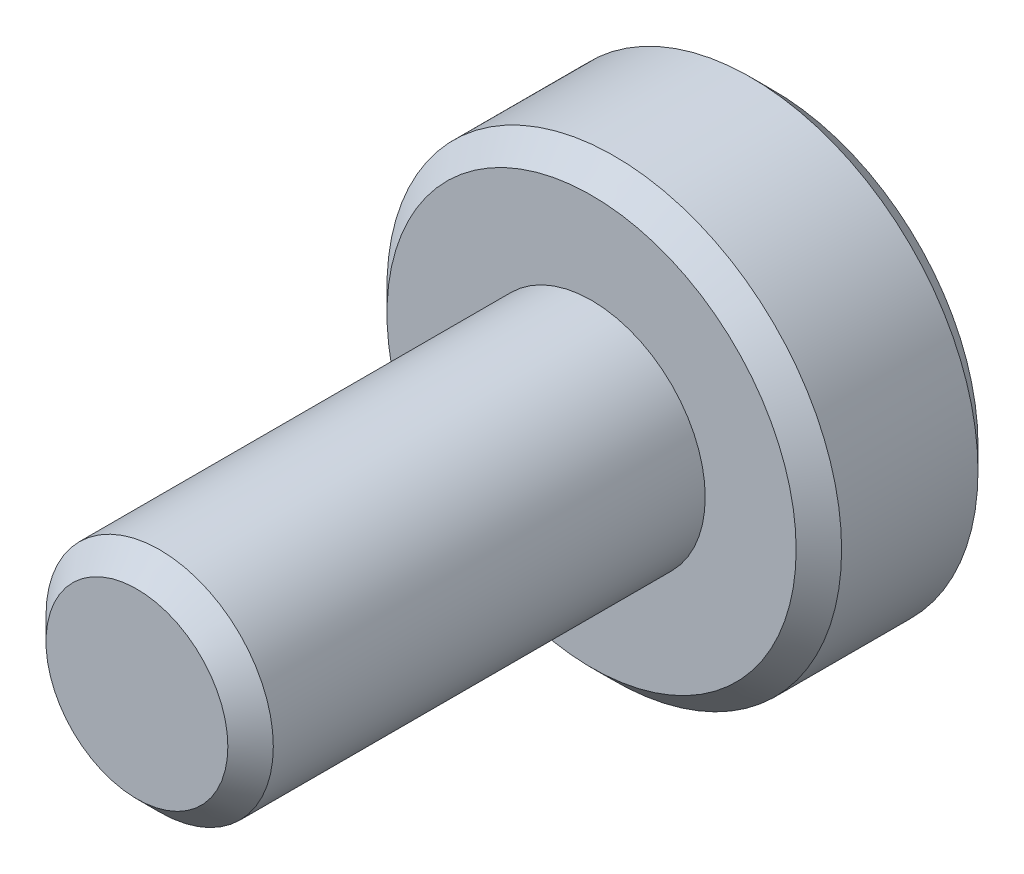
ISO-10303-21;
HEADER;
FILE_DESCRIPTION(('STEP AP214'),'2;1');
FILE_NAME('part.step','',(''),(''),'','','');
FILE_SCHEMA(('AUTOMOTIVE_DESIGN { 1 0 10303 214 1 1 1 1 }'));
ENDSEC;
DATA;
#1=APPLICATION_CONTEXT('core data for automotive mechanical design processes');
#2=APPLICATION_PROTOCOL_DEFINITION('international standard','automotive_design',2000,#1);
#3=PRODUCT_CONTEXT('',#1,'mechanical');
#4=PRODUCT('Part','Part','',(#3));
#5=PRODUCT_RELATED_PRODUCT_CATEGORY('part','',(#4));
#6=PRODUCT_DEFINITION_FORMATION('','',#4);
#7=PRODUCT_DEFINITION_CONTEXT('part definition',#1,'design');
#8=PRODUCT_DEFINITION('design','',#6,#7);
#9=PRODUCT_DEFINITION_SHAPE('','',#8);
#10=(LENGTH_UNIT() NAMED_UNIT(*) SI_UNIT(.MILLI.,.METRE.));
#11=(NAMED_UNIT(*) PLANE_ANGLE_UNIT() SI_UNIT($,.RADIAN.));
#12=(NAMED_UNIT(*) SI_UNIT($,.STERADIAN.) SOLID_ANGLE_UNIT());
#13=UNCERTAINTY_MEASURE_WITH_UNIT(LENGTH_MEASURE(1.E-05),#10,'distance_accuracy_value','');
#14=(GEOMETRIC_REPRESENTATION_CONTEXT(3) GLOBAL_UNCERTAINTY_ASSIGNED_CONTEXT((#13)) GLOBAL_UNIT_ASSIGNED_CONTEXT((#10,
#11,#12)) REPRESENTATION_CONTEXT('',''));
#15=CARTESIAN_POINT('',(0.,0.,0.));
#16=DIRECTION('',(0.,0.,1.));
#17=DIRECTION('',(1.,0.,0.));
#18=AXIS2_PLACEMENT_3D('',#15,#16,#17);
#19=CARTESIAN_POINT('',(0.,0.,8.));
#20=DIRECTION('',(0.,0.,-1.));
#21=DIRECTION('',(-1.,0.,0.));
#22=AXIS2_PLACEMENT_3D('',#19,#20,#21);
#23=CYLINDRICAL_SURFACE('',#22,10.);
#24=CARTESIAN_POINT('',(0.,0.,0.999999999999996));
#25=DIRECTION('',(0.,0.,1.));
#26=DIRECTION('',(1.,0.,0.));
#27=AXIS2_PLACEMENT_3D('',#24,#25,#26);
#28=CIRCLE('',#27,10.);
#29=CARTESIAN_POINT('',(10.,0.,0.999999999999996));
#30=VERTEX_POINT('',#29);
#31=EDGE_CURVE('E64',#30,#30,#28,.T.);
#32=ORIENTED_EDGE('',*,*,#31,.T.);
#33=EDGE_LOOP('',(#32));
#34=FACE_BOUND('',#33,.T.);
#35=CARTESIAN_POINT('',(0.,0.,7.));
#36=DIRECTION('',(0.,0.,1.));
#37=DIRECTION('',(1.,0.,0.));
#38=AXIS2_PLACEMENT_3D('',#35,#36,#37);
#39=CIRCLE('',#38,10.);
#40=CARTESIAN_POINT('',(10.,0.,7.));
#41=VERTEX_POINT('',#40);
#42=EDGE_CURVE('E68',#41,#41,#39,.F.);
#43=ORIENTED_EDGE('',*,*,#42,.T.);
#44=EDGE_LOOP('',(#43));
#45=FACE_BOUND('',#44,.T.);
#46=ADVANCED_FACE('F39',(#34,#45),#23,.T.);
#47=CARTESIAN_POINT('',(0.,0.,8.));
#48=DIRECTION('',(0.,0.,1.));
#49=DIRECTION('',(1.,0.,0.));
#50=AXIS2_PLACEMENT_3D('',#47,#48,#49);
#51=PLANE('',#50);
#52=CARTESIAN_POINT('',(0.,0.,8.));
#53=DIRECTION('',(0.,0.,1.));
#54=DIRECTION('',(1.,0.,0.));
#55=AXIS2_PLACEMENT_3D('',#52,#53,#54);
#56=CIRCLE('',#55,9.);
#57=CARTESIAN_POINT('',(9.,0.,8.));
#58=VERTEX_POINT('',#57);
#59=EDGE_CURVE('E53',#58,#58,#56,.T.);
#60=ORIENTED_EDGE('',*,*,#59,.T.);
#61=EDGE_LOOP('',(#60));
#62=FACE_BOUND('',#61,.T.);
#63=CARTESIAN_POINT('',(0.,0.,8.));
#64=DIRECTION('',(0.,0.,1.));
#65=DIRECTION('',(1.,0.,0.));
#66=AXIS2_PLACEMENT_3D('',#63,#64,#65);
#67=CIRCLE('',#66,5.);
#68=CARTESIAN_POINT('',(5.,0.,8.));
#69=VERTEX_POINT('',#68);
#70=EDGE_CURVE('E72',#69,#69,#67,.T.);
#71=ORIENTED_EDGE('',*,*,#70,.F.);
#72=EDGE_LOOP('',(#71));
#73=FACE_BOUND('',#72,.T.);
#74=ADVANCED_FACE('F79',(#62,#73),#51,.T.);
#75=CARTESIAN_POINT('',(0.,0.,0.));
#76=DIRECTION('',(0.,0.,1.));
#77=DIRECTION('',(1.,0.,0.));
#78=AXIS2_PLACEMENT_3D('',#75,#76,#77);
#79=PLANE('',#78);
#80=CARTESIAN_POINT('',(0.,0.,0.));
#81=DIRECTION('',(0.,0.,1.));
#82=DIRECTION('',(1.,0.,0.));
#83=AXIS2_PLACEMENT_3D('',#80,#81,#82);
#84=CIRCLE('',#83,9.);
#85=CARTESIAN_POINT('',(9.,0.,0.));
#86=VERTEX_POINT('',#85);
#87=EDGE_CURVE('E58',#86,#86,#84,.F.);
#88=ORIENTED_EDGE('',*,*,#87,.T.);
#89=EDGE_LOOP('',(#88));
#90=FACE_BOUND('',#89,.T.);
#91=ADVANCED_FACE('F81',(#90),#79,.F.);
#92=CARTESIAN_POINT('',(0.,0.,28.));
#93=DIRECTION('',(0.,0.,-1.));
#94=DIRECTION('',(-1.,0.,0.));
#95=AXIS2_PLACEMENT_3D('',#92,#93,#94);
#96=CYLINDRICAL_SURFACE('',#95,5.);
#97=CARTESIAN_POINT('',(0.,0.,27.));
#98=DIRECTION('',(0.,0.,1.));
#99=DIRECTION('',(1.,0.,0.));
#100=AXIS2_PLACEMENT_3D('',#97,#98,#99);
#101=CIRCLE('',#100,5.);
#102=CARTESIAN_POINT('',(5.,0.,27.));
#103=VERTEX_POINT('',#102);
#104=EDGE_CURVE('E10',#103,#103,#101,.F.);
#105=ORIENTED_EDGE('',*,*,#104,.T.);
#106=EDGE_LOOP('',(#105));
#107=FACE_BOUND('',#106,.T.);
#108=ORIENTED_EDGE('',*,*,#70,.T.);
#109=EDGE_LOOP('',(#108));
#110=FACE_BOUND('',#109,.T.);
#111=ADVANCED_FACE('F77',(#107,#110),#96,.T.);
#112=CARTESIAN_POINT('',(0.,0.,28.));
#113=DIRECTION('',(0.,0.,1.));
#114=DIRECTION('',(1.,0.,0.));
#115=AXIS2_PLACEMENT_3D('',#112,#113,#114);
#116=PLANE('',#115);
#117=CARTESIAN_POINT('',(0.,0.,28.));
#118=DIRECTION('',(0.,0.,1.));
#119=DIRECTION('',(1.,0.,0.));
#120=AXIS2_PLACEMENT_3D('',#117,#118,#119);
#121=CIRCLE('',#120,4.);
#122=CARTESIAN_POINT('',(4.,0.,28.));
#123=VERTEX_POINT('',#122);
#124=EDGE_CURVE('E48',#123,#123,#121,.T.);
#125=ORIENTED_EDGE('',*,*,#124,.T.);
#126=EDGE_LOOP('',(#125));
#127=FACE_BOUND('',#126,.T.);
#128=ADVANCED_FACE('F102',(#127),#116,.T.);
#129=CARTESIAN_POINT('',(0.,0.,0.999999999999996));
#130=DIRECTION('',(0.,0.,1.));
#131=DIRECTION('',(1.,0.,0.));
#132=AXIS2_PLACEMENT_3D('',#129,#130,#131);
#133=CONICAL_SURFACE('',#132,10.,0.78539816339745);
#134=ORIENTED_EDGE('',*,*,#87,.F.);
#135=EDGE_LOOP('',(#134));
#136=FACE_BOUND('',#135,.T.);
#137=ORIENTED_EDGE('',*,*,#31,.F.);
#138=EDGE_LOOP('',(#137));
#139=FACE_BOUND('',#138,.T.);
#140=ADVANCED_FACE('F96',(#136,#139),#133,.T.);
#141=CARTESIAN_POINT('',(0.,0.,8.));
#142=DIRECTION('',(0.,0.,-1.));
#143=DIRECTION('',(-1.,0.,0.));
#144=AXIS2_PLACEMENT_3D('',#141,#142,#143);
#145=CONICAL_SURFACE('',#144,9.,0.785398163397447);
#146=ORIENTED_EDGE('',*,*,#42,.F.);
#147=EDGE_LOOP('',(#146));
#148=FACE_BOUND('',#147,.T.);
#149=ORIENTED_EDGE('',*,*,#59,.F.);
#150=EDGE_LOOP('',(#149));
#151=FACE_BOUND('',#150,.T.);
#152=ADVANCED_FACE('F101',(#148,#151),#145,.T.);
#153=CARTESIAN_POINT('',(0.,0.,28.));
#154=DIRECTION('',(0.,0.,-1.));
#155=DIRECTION('',(-1.,0.,0.));
#156=AXIS2_PLACEMENT_3D('',#153,#154,#155);
#157=CONICAL_SURFACE('',#156,4.,0.785398163397446);
#158=ORIENTED_EDGE('',*,*,#104,.F.);
#159=EDGE_LOOP('',(#158));
#160=FACE_BOUND('',#159,.T.);
#161=ORIENTED_EDGE('',*,*,#124,.F.);
#162=EDGE_LOOP('',(#161));
#163=FACE_BOUND('',#162,.T.);
#164=ADVANCED_FACE('F42',(#160,#163),#157,.T.);
#165=CLOSED_SHELL('',(#46,#74,#91,#111,#128,#140,#152,#164));
#166=MANIFOLD_SOLID_BREP('B2',#165);
#167=ADVANCED_BREP_SHAPE_REPRESENTATION('',(#18,#166),#14);
#168=SHAPE_DEFINITION_REPRESENTATION(#9,#167);
ENDSEC;
END-ISO-10303-21;
